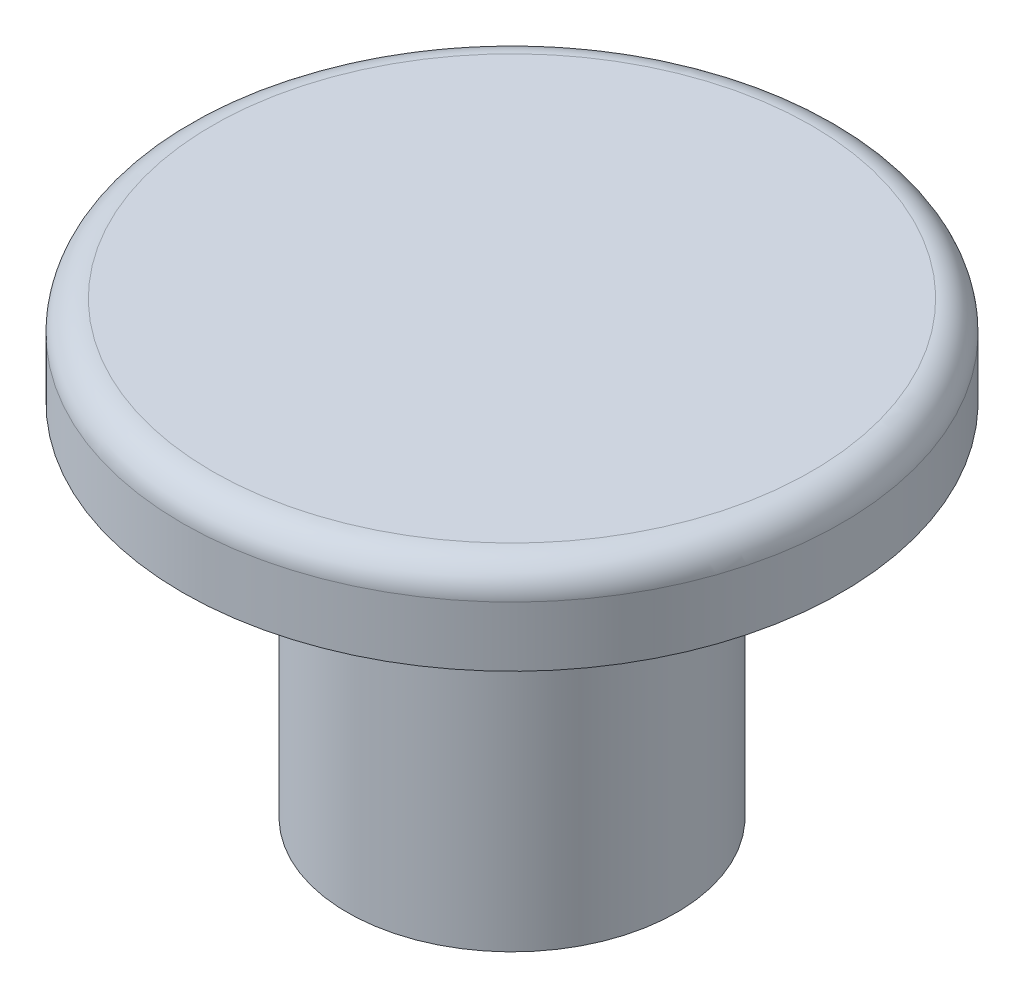
ISO-10303-21;
HEADER;
FILE_DESCRIPTION(('STEP AP214'),'2;1');
FILE_NAME('part.step','',(''),(''),'','','');
FILE_SCHEMA(('AUTOMOTIVE_DESIGN { 1 0 10303 214 1 1 1 1 }'));
ENDSEC;
DATA;
#1=APPLICATION_CONTEXT('core data for automotive mechanical design processes');
#2=APPLICATION_PROTOCOL_DEFINITION('international standard','automotive_design',2000,#1);
#3=PRODUCT_CONTEXT('',#1,'mechanical');
#4=PRODUCT('Part','Part','',(#3));
#5=PRODUCT_RELATED_PRODUCT_CATEGORY('part','',(#4));
#6=PRODUCT_DEFINITION_FORMATION('','',#4);
#7=PRODUCT_DEFINITION_CONTEXT('part definition',#1,'design');
#8=PRODUCT_DEFINITION('design','',#6,#7);
#9=PRODUCT_DEFINITION_SHAPE('','',#8);
#10=(LENGTH_UNIT() NAMED_UNIT(*) SI_UNIT(.MILLI.,.METRE.));
#11=(NAMED_UNIT(*) PLANE_ANGLE_UNIT() SI_UNIT($,.RADIAN.));
#12=(NAMED_UNIT(*) SI_UNIT($,.STERADIAN.) SOLID_ANGLE_UNIT());
#13=UNCERTAINTY_MEASURE_WITH_UNIT(LENGTH_MEASURE(1.E-05),#10,'distance_accuracy_value','');
#14=(GEOMETRIC_REPRESENTATION_CONTEXT(3) GLOBAL_UNCERTAINTY_ASSIGNED_CONTEXT((#13)) GLOBAL_UNIT_ASSIGNED_CONTEXT((#10,
#11,#12)) REPRESENTATION_CONTEXT('',''));
#15=CARTESIAN_POINT('',(0.,0.,0.));
#16=DIRECTION('',(0.,0.,1.));
#17=DIRECTION('',(1.,0.,0.));
#18=AXIS2_PLACEMENT_3D('',#15,#16,#17);
#19=CARTESIAN_POINT('',(0.,3.,0.));
#20=DIRECTION('',(0.,-1.,0.));
#21=DIRECTION('',(0.,0.,-1.));
#22=AXIS2_PLACEMENT_3D('',#19,#20,#21);
#23=CYLINDRICAL_SURFACE('',#22,11.);
#24=CARTESIAN_POINT('',(0.,2.,0.));
#25=DIRECTION('',(0.,1.,0.));
#26=DIRECTION('',(0.,0.,1.));
#27=AXIS2_PLACEMENT_3D('',#24,#25,#26);
#28=CIRCLE('',#27,11.);
#29=CARTESIAN_POINT('',(0.,2.,11.));
#30=VERTEX_POINT('',#29);
#31=EDGE_CURVE('E10',#30,#30,#28,.F.);
#32=ORIENTED_EDGE('',*,*,#31,.T.);
#33=EDGE_LOOP('',(#32));
#34=FACE_BOUND('',#33,.T.);
#35=CARTESIAN_POINT('',(0.,0.,0.));
#36=DIRECTION('',(0.,1.,0.));
#37=DIRECTION('',(0.,0.,1.));
#38=AXIS2_PLACEMENT_3D('',#35,#36,#37);
#39=CIRCLE('',#38,11.);
#40=CARTESIAN_POINT('',(0.,0.,11.));
#41=VERTEX_POINT('',#40);
#42=EDGE_CURVE('E50',#41,#41,#39,.T.);
#43=ORIENTED_EDGE('',*,*,#42,.T.);
#44=EDGE_LOOP('',(#43));
#45=FACE_BOUND('',#44,.T.);
#46=ADVANCED_FACE('F35',(#34,#45),#23,.T.);
#47=CARTESIAN_POINT('',(0.,3.,0.));
#48=DIRECTION('',(0.,1.,0.));
#49=DIRECTION('',(0.,0.,1.));
#50=AXIS2_PLACEMENT_3D('',#47,#48,#49);
#51=PLANE('',#50);
#52=CARTESIAN_POINT('',(0.,3.,0.));
#53=DIRECTION('',(0.,1.,0.));
#54=DIRECTION('',(0.,0.,1.));
#55=AXIS2_PLACEMENT_3D('',#52,#53,#54);
#56=CIRCLE('',#55,10.);
#57=CARTESIAN_POINT('',(0.,3.,10.));
#58=VERTEX_POINT('',#57);
#59=EDGE_CURVE('E42',#58,#58,#56,.T.);
#60=ORIENTED_EDGE('',*,*,#59,.T.);
#61=EDGE_LOOP('',(#60));
#62=FACE_BOUND('',#61,.T.);
#63=ADVANCED_FACE('F70',(#62),#51,.T.);
#64=CARTESIAN_POINT('',(0.,0.,0.));
#65=DIRECTION('',(0.,1.,0.));
#66=DIRECTION('',(0.,0.,1.));
#67=AXIS2_PLACEMENT_3D('',#64,#65,#66);
#68=PLANE('',#67);
#69=CARTESIAN_POINT('',(0.,0.,0.));
#70=DIRECTION('',(0.,-1.,0.));
#71=DIRECTION('',(0.,0.,-1.));
#72=AXIS2_PLACEMENT_3D('',#69,#70,#71);
#73=CIRCLE('',#72,5.5);
#74=CARTESIAN_POINT('',(0.,0.,-5.5));
#75=VERTEX_POINT('',#74);
#76=EDGE_CURVE('E46',#75,#75,#73,.T.);
#77=ORIENTED_EDGE('',*,*,#76,.F.);
#78=EDGE_LOOP('',(#77));
#79=FACE_BOUND('',#78,.T.);
#80=ORIENTED_EDGE('',*,*,#42,.F.);
#81=EDGE_LOOP('',(#80));
#82=FACE_BOUND('',#81,.T.);
#83=ADVANCED_FACE('F64',(#79,#82),#68,.F.);
#84=CARTESIAN_POINT('',(0.,-12.,0.));
#85=DIRECTION('',(0.,1.,0.));
#86=DIRECTION('',(0.,0.,1.));
#87=AXIS2_PLACEMENT_3D('',#84,#85,#86);
#88=CYLINDRICAL_SURFACE('',#87,5.5);
#89=CARTESIAN_POINT('',(0.,-12.,0.));
#90=DIRECTION('',(0.,-1.,0.));
#91=DIRECTION('',(0.,0.,-1.));
#92=AXIS2_PLACEMENT_3D('',#89,#90,#91);
#93=CIRCLE('',#92,5.5);
#94=CARTESIAN_POINT('',(0.,-12.,-5.5));
#95=VERTEX_POINT('',#94);
#96=EDGE_CURVE('E54',#95,#95,#93,.T.);
#97=ORIENTED_EDGE('',*,*,#96,.F.);
#98=EDGE_LOOP('',(#97));
#99=FACE_BOUND('',#98,.T.);
#100=ORIENTED_EDGE('',*,*,#76,.T.);
#101=EDGE_LOOP('',(#100));
#102=FACE_BOUND('',#101,.T.);
#103=ADVANCED_FACE('F61',(#99,#102),#88,.T.);
#104=CARTESIAN_POINT('',(0.,-12.,0.));
#105=DIRECTION('',(0.,-1.,0.));
#106=DIRECTION('',(0.,0.,-1.));
#107=AXIS2_PLACEMENT_3D('',#104,#105,#106);
#108=PLANE('',#107);
#109=ORIENTED_EDGE('',*,*,#96,.T.);
#110=EDGE_LOOP('',(#109));
#111=FACE_BOUND('',#110,.T.);
#112=ADVANCED_FACE('F59',(#111),#108,.T.);
#113=CARTESIAN_POINT('',(0.,2.,0.));
#114=DIRECTION('',(0.,1.,0.));
#115=DIRECTION('',(0.,0.,1.));
#116=AXIS2_PLACEMENT_3D('',#113,#114,#115);
#117=TOROIDAL_SURFACE('',#116,10.,1.);
#118=ORIENTED_EDGE('',*,*,#31,.F.);
#119=EDGE_LOOP('',(#118));
#120=FACE_BOUND('',#119,.T.);
#121=ORIENTED_EDGE('',*,*,#59,.F.);
#122=EDGE_LOOP('',(#121));
#123=FACE_BOUND('',#122,.T.);
#124=ADVANCED_FACE('F37',(#120,#123),#117,.T.);
#125=CLOSED_SHELL('',(#46,#63,#83,#103,#112,#124));
#126=MANIFOLD_SOLID_BREP('B2',#125);
#127=ADVANCED_BREP_SHAPE_REPRESENTATION('',(#18,#126),#14);
#128=SHAPE_DEFINITION_REPRESENTATION(#9,#127);
ENDSEC;
END-ISO-10303-21;
